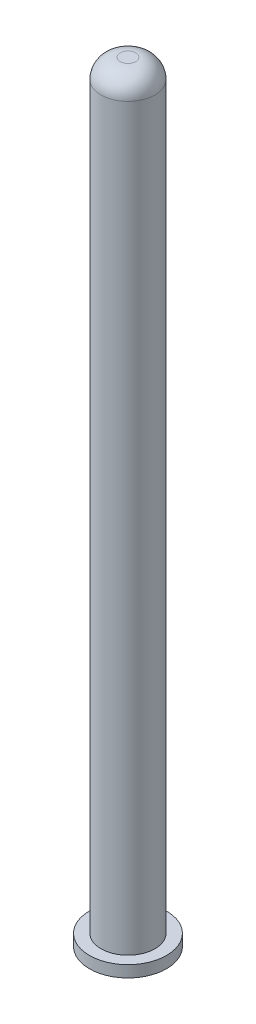
ISO-10303-21;
HEADER;
FILE_DESCRIPTION(('STEP AP214'),'2;1');
FILE_NAME('part.step','',(''),(''),'','','');
FILE_SCHEMA(('AUTOMOTIVE_DESIGN { 1 0 10303 214 1 1 1 1 }'));
ENDSEC;
DATA;
#1=APPLICATION_CONTEXT('core data for automotive mechanical design processes');
#2=APPLICATION_PROTOCOL_DEFINITION('international standard','automotive_design',2000,#1);
#3=PRODUCT_CONTEXT('',#1,'mechanical');
#4=PRODUCT('Part','Part','',(#3));
#5=PRODUCT_RELATED_PRODUCT_CATEGORY('part','',(#4));
#6=PRODUCT_DEFINITION_FORMATION('','',#4);
#7=PRODUCT_DEFINITION_CONTEXT('part definition',#1,'design');
#8=PRODUCT_DEFINITION('design','',#6,#7);
#9=PRODUCT_DEFINITION_SHAPE('','',#8);
#10=(LENGTH_UNIT() NAMED_UNIT(*) SI_UNIT(.MILLI.,.METRE.));
#11=(NAMED_UNIT(*) PLANE_ANGLE_UNIT() SI_UNIT($,.RADIAN.));
#12=(NAMED_UNIT(*) SI_UNIT($,.STERADIAN.) SOLID_ANGLE_UNIT());
#13=UNCERTAINTY_MEASURE_WITH_UNIT(LENGTH_MEASURE(1.E-05),#10,'distance_accuracy_value','');
#14=(GEOMETRIC_REPRESENTATION_CONTEXT(3) GLOBAL_UNCERTAINTY_ASSIGNED_CONTEXT((#13)) GLOBAL_UNIT_ASSIGNED_CONTEXT((#10,
#11,#12)) REPRESENTATION_CONTEXT('',''));
#15=CARTESIAN_POINT('',(0.,0.,0.));
#16=DIRECTION('',(0.,0.,1.));
#17=DIRECTION('',(1.,0.,0.));
#18=AXIS2_PLACEMENT_3D('',#15,#16,#17);
#19=CARTESIAN_POINT('',(0.,200.,-7.00000000000001));
#20=DIRECTION('',(0.,-1.,0.));
#21=DIRECTION('',(0.,0.,-0.999999999999999));
#22=AXIS2_PLACEMENT_3D('',#19,#20,#21);
#23=PLANE('',#22);
#24=CARTESIAN_POINT('',(0.,200.,0.));
#25=DIRECTION('',(0.,-1.,0.));
#26=DIRECTION('',(0.,0.,-0.999999999999999));
#27=AXIS2_PLACEMENT_3D('',#24,#25,#26);
#28=CIRCLE('',#27,2.);
#29=CARTESIAN_POINT('',(0.,200.,-2.));
#30=VERTEX_POINT('',#29);
#31=EDGE_CURVE('E44',#30,#30,#28,.F.);
#32=ORIENTED_EDGE('',*,*,#31,.T.);
#33=EDGE_LOOP('',(#32));
#34=FACE_BOUND('',#33,.T.);
#35=ADVANCED_FACE('F37',(#34),#23,.F.);
#36=CARTESIAN_POINT('',(0.,0.,0.));
#37=DIRECTION('',(0.,1.,0.));
#38=DIRECTION('',(0.,0.,0.999999999999999));
#39=AXIS2_PLACEMENT_3D('',#36,#37,#38);
#40=PLANE('',#39);
#41=CARTESIAN_POINT('',(0.,0.,0.));
#42=DIRECTION('',(0.,1.,0.));
#43=DIRECTION('',(0.,0.,0.999999999999999));
#44=AXIS2_PLACEMENT_3D('',#41,#42,#43);
#45=CIRCLE('',#44,10.);
#46=CARTESIAN_POINT('',(0.,0.,9.99999999999999));
#47=VERTEX_POINT('',#46);
#48=EDGE_CURVE('E48',#47,#47,#45,.T.);
#49=ORIENTED_EDGE('',*,*,#48,.F.);
#50=EDGE_LOOP('',(#49));
#51=FACE_BOUND('',#50,.T.);
#52=ADVANCED_FACE('F72',(#51),#40,.F.);
#53=CARTESIAN_POINT('',(0.,200.,0.));
#54=DIRECTION('',(0.,1.,0.));
#55=DIRECTION('',(0.,0.,0.999999999999999));
#56=AXIS2_PLACEMENT_3D('',#53,#54,#55);
#57=CYLINDRICAL_SURFACE('',#56,10.);
#58=CARTESIAN_POINT('',(0.,3.,0.));
#59=DIRECTION('',(0.,1.,0.));
#60=DIRECTION('',(0.,0.,0.999999999999999));
#61=AXIS2_PLACEMENT_3D('',#58,#59,#60);
#62=CIRCLE('',#61,10.);
#63=CARTESIAN_POINT('',(0.,3.,9.99999999999999));
#64=VERTEX_POINT('',#63);
#65=EDGE_CURVE('E52',#64,#64,#62,.T.);
#66=ORIENTED_EDGE('',*,*,#65,.F.);
#67=EDGE_LOOP('',(#66));
#68=FACE_BOUND('',#67,.T.);
#69=ORIENTED_EDGE('',*,*,#48,.T.);
#70=EDGE_LOOP('',(#69));
#71=FACE_BOUND('',#70,.T.);
#72=ADVANCED_FACE('F66',(#68,#71),#57,.T.);
#73=CARTESIAN_POINT('',(0.,3.,-9.99999999999995));
#74=DIRECTION('',(0.,-1.,0.));
#75=DIRECTION('',(0.,0.,-0.999999999999999));
#76=AXIS2_PLACEMENT_3D('',#73,#74,#75);
#77=PLANE('',#76);
#78=CARTESIAN_POINT('',(0.,3.,0.));
#79=DIRECTION('',(0.,1.,0.));
#80=DIRECTION('',(0.,0.,0.999999999999999));
#81=AXIS2_PLACEMENT_3D('',#78,#79,#80);
#82=CIRCLE('',#81,7.);
#83=CARTESIAN_POINT('',(0.,3.,6.99999999999999));
#84=VERTEX_POINT('',#83);
#85=EDGE_CURVE('E57',#84,#84,#82,.T.);
#86=ORIENTED_EDGE('',*,*,#85,.F.);
#87=EDGE_LOOP('',(#86));
#88=FACE_BOUND('',#87,.T.);
#89=ORIENTED_EDGE('',*,*,#65,.T.);
#90=EDGE_LOOP('',(#89));
#91=FACE_BOUND('',#90,.T.);
#92=ADVANCED_FACE('F63',(#88,#91),#77,.F.);
#93=CARTESIAN_POINT('',(0.,200.,0.));
#94=DIRECTION('',(0.,1.,0.));
#95=DIRECTION('',(0.,0.,0.999999999999999));
#96=AXIS2_PLACEMENT_3D('',#93,#94,#95);
#97=CYLINDRICAL_SURFACE('',#96,7.);
#98=CARTESIAN_POINT('',(0.,195.,0.));
#99=DIRECTION('',(0.,-1.,0.));
#100=DIRECTION('',(0.,0.,-0.999999999999999));
#101=AXIS2_PLACEMENT_3D('',#98,#99,#100);
#102=CIRCLE('',#101,7.);
#103=CARTESIAN_POINT('',(0.,195.,-6.99999999999999));
#104=VERTEX_POINT('',#103);
#105=EDGE_CURVE('E10',#104,#104,#102,.T.);
#106=ORIENTED_EDGE('',*,*,#105,.T.);
#107=EDGE_LOOP('',(#106));
#108=FACE_BOUND('',#107,.T.);
#109=ORIENTED_EDGE('',*,*,#85,.T.);
#110=EDGE_LOOP('',(#109));
#111=FACE_BOUND('',#110,.T.);
#112=ADVANCED_FACE('F61',(#108,#111),#97,.T.);
#113=CARTESIAN_POINT('',(0.,195.,0.));
#114=DIRECTION('',(0.,-1.,0.));
#115=DIRECTION('',(0.,0.,-0.999999999999999));
#116=AXIS2_PLACEMENT_3D('',#113,#114,#115);
#117=DEGENERATE_TOROIDAL_SURFACE('',#116,2.,5.,.T.);
#118=ORIENTED_EDGE('',*,*,#105,.F.);
#119=EDGE_LOOP('',(#118));
#120=FACE_BOUND('',#119,.T.);
#121=ORIENTED_EDGE('',*,*,#31,.F.);
#122=EDGE_LOOP('',(#121));
#123=FACE_BOUND('',#122,.T.);
#124=ADVANCED_FACE('F39',(#120,#123),#117,.T.);
#125=CLOSED_SHELL('',(#35,#52,#72,#92,#112,#124));
#126=MANIFOLD_SOLID_BREP('B2',#125);
#127=ADVANCED_BREP_SHAPE_REPRESENTATION('',(#18,#126),#14);
#128=SHAPE_DEFINITION_REPRESENTATION(#9,#127);
ENDSEC;
END-ISO-10303-21;
